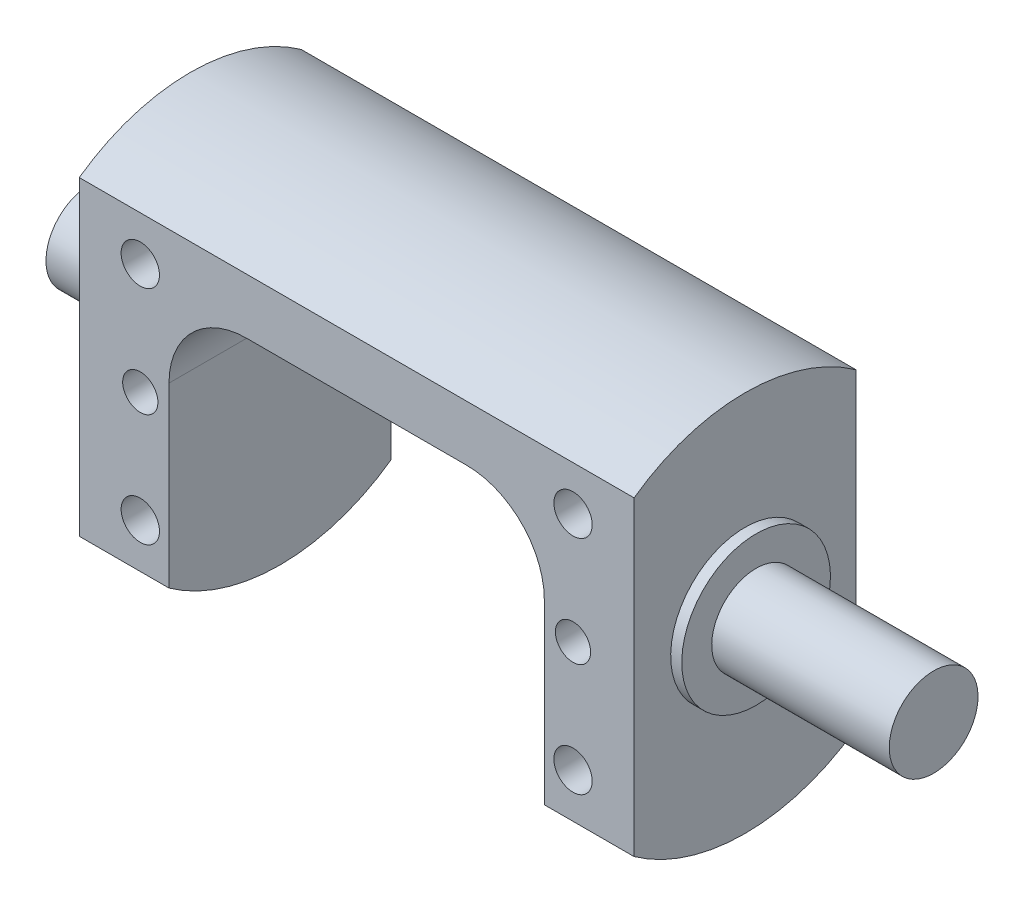
ISO-10303-21;
HEADER;
FILE_DESCRIPTION(('STEP AP214'),'2;1');
FILE_NAME('part.step','',(''),(''),'','','');
FILE_SCHEMA(('AUTOMOTIVE_DESIGN { 1 0 10303 214 1 1 1 1 }'));
ENDSEC;
DATA;
#1=APPLICATION_CONTEXT('core data for automotive mechanical design processes');
#2=APPLICATION_PROTOCOL_DEFINITION('international standard','automotive_design',2000,#1);
#3=PRODUCT_CONTEXT('',#1,'mechanical');
#4=PRODUCT('Part','Part','',(#3));
#5=PRODUCT_RELATED_PRODUCT_CATEGORY('part','',(#4));
#6=PRODUCT_DEFINITION_FORMATION('','',#4);
#7=PRODUCT_DEFINITION_CONTEXT('part definition',#1,'design');
#8=PRODUCT_DEFINITION('design','',#6,#7);
#9=PRODUCT_DEFINITION_SHAPE('','',#8);
#10=(LENGTH_UNIT() NAMED_UNIT(*) SI_UNIT(.MILLI.,.METRE.));
#11=(NAMED_UNIT(*) PLANE_ANGLE_UNIT() SI_UNIT($,.RADIAN.));
#12=(NAMED_UNIT(*) SI_UNIT($,.STERADIAN.) SOLID_ANGLE_UNIT());
#13=UNCERTAINTY_MEASURE_WITH_UNIT(LENGTH_MEASURE(1.E-05),#10,'distance_accuracy_value','');
#14=(GEOMETRIC_REPRESENTATION_CONTEXT(3) GLOBAL_UNCERTAINTY_ASSIGNED_CONTEXT((#13)) GLOBAL_UNIT_ASSIGNED_CONTEXT((#10,
#11,#12)) REPRESENTATION_CONTEXT('',''));
#15=CARTESIAN_POINT('',(0.,0.,0.));
#16=DIRECTION('',(0.,0.,1.));
#17=DIRECTION('',(1.,0.,0.));
#18=AXIS2_PLACEMENT_3D('',#15,#16,#17);
#19=CARTESIAN_POINT('',(-34.,0.,0.));
#20=DIRECTION('',(-1.,0.,0.));
#21=DIRECTION('',(0.,-1.,0.));
#22=AXIS2_PLACEMENT_3D('',#19,#20,#21);
#23=CYLINDRICAL_SURFACE('',#22,17.2046505340852);
#24=DIRECTION('',(-1.,0.,0.));
#25=VECTOR('',#24,1.);
#26=CARTESIAN_POINT('',(-34.,-14.,-9.99999999999999));
#27=LINE('',#26,#25);
#28=CARTESIAN_POINT('',(-16.9125,-14.,-9.99999999999999));
#29=VERTEX_POINT('',#28);
#30=CARTESIAN_POINT('',(-25.,-14.,-9.99999999999999));
#31=VERTEX_POINT('',#30);
#32=EDGE_CURVE('E267',#29,#31,#27,.T.);
#33=ORIENTED_EDGE('',*,*,#32,.F.);
#34=CARTESIAN_POINT('',(-16.9125,0.,0.));
#35=DIRECTION('',(-1.,0.,0.));
#36=DIRECTION('',(0.,0.,1.));
#37=AXIS2_PLACEMENT_3D('',#34,#35,#36);
#38=CIRCLE('',#37,17.2046505340852);
#39=CARTESIAN_POINT('',(-16.9125,-14.,10.));
#40=VERTEX_POINT('',#39);
#41=EDGE_CURVE('E96',#29,#40,#38,.T.);
#42=ORIENTED_EDGE('',*,*,#41,.T.);
#43=DIRECTION('',(-1.,0.,0.));
#44=VECTOR('',#43,1.);
#45=CARTESIAN_POINT('',(-34.,-14.,10.));
#46=LINE('',#45,#44);
#47=CARTESIAN_POINT('',(-25.,-14.,10.));
#48=VERTEX_POINT('',#47);
#49=EDGE_CURVE('E150',#48,#40,#46,.F.);
#50=ORIENTED_EDGE('',*,*,#49,.F.);
#51=CARTESIAN_POINT('',(-25.,0.,0.));
#52=DIRECTION('',(-1.,0.,0.));
#53=DIRECTION('',(0.,-1.,0.));
#54=AXIS2_PLACEMENT_3D('',#51,#52,#53);
#55=CIRCLE('',#54,17.2046505340852);
#56=EDGE_CURVE('E159',#31,#48,#55,.T.);
#57=ORIENTED_EDGE('',*,*,#56,.F.);
#58=EDGE_LOOP('',(#33,#42,#50,#57));
#59=FACE_BOUND('',#58,.T.);
#60=ADVANCED_FACE('F42',(#59),#23,.T.);
#61=CARTESIAN_POINT('',(-34.,4.,0.));
#62=DIRECTION('',(1.,0.,0.));
#63=DIRECTION('',(0.,1.,0.));
#64=AXIS2_PLACEMENT_3D('',#61,#62,#63);
#65=PLANE('',#64);
#66=CARTESIAN_POINT('',(-34.,0.,0.));
#67=DIRECTION('',(-1.,0.,0.));
#68=DIRECTION('',(0.,-1.,0.));
#69=AXIS2_PLACEMENT_3D('',#66,#67,#68);
#70=CIRCLE('',#69,4.);
#71=CARTESIAN_POINT('',(-34.,-4.,0.));
#72=VERTEX_POINT('',#71);
#73=EDGE_CURVE('E273',#72,#72,#70,.T.);
#74=ORIENTED_EDGE('',*,*,#73,.T.);
#75=EDGE_LOOP('',(#74));
#76=FACE_BOUND('',#75,.T.);
#77=CARTESIAN_POINT('',(-34.,0.,0.));
#78=DIRECTION('',(-1.,0.,0.));
#79=DIRECTION('',(0.,0.,1.));
#80=AXIS2_PLACEMENT_3D('',#77,#78,#79);
#81=CIRCLE('',#80,1.7272);
#82=CARTESIAN_POINT('',(-34.,0.,1.7272));
#83=VERTEX_POINT('',#82);
#84=EDGE_CURVE('E209',#83,#83,#81,.T.);
#85=ORIENTED_EDGE('',*,*,#84,.F.);
#86=EDGE_LOOP('',(#85));
#87=FACE_BOUND('',#86,.T.);
#88=ADVANCED_FACE('F44',(#76,#87),#65,.F.);
#89=CARTESIAN_POINT('',(25.,6.69999999999999,0.));
#90=DIRECTION('',(-1.,0.,0.));
#91=DIRECTION('',(0.,-1.,0.));
#92=AXIS2_PLACEMENT_3D('',#89,#90,#91);
#93=PLANE('',#92);
#94=CARTESIAN_POINT('',(25.,0.,0.));
#95=DIRECTION('',(-1.,0.,0.));
#96=DIRECTION('',(0.,-1.,0.));
#97=AXIS2_PLACEMENT_3D('',#94,#95,#96);
#98=CIRCLE('',#97,6.69999999999999);
#99=CARTESIAN_POINT('',(25.,-6.69999999999999,0.));
#100=VERTEX_POINT('',#99);
#101=EDGE_CURVE('E177',#100,#100,#98,.T.);
#102=ORIENTED_EDGE('',*,*,#101,.T.);
#103=EDGE_LOOP('',(#102));
#104=FACE_BOUND('',#103,.T.);
#105=DIRECTION('',(0.,-1.,0.));
#106=VECTOR('',#105,1.);
#107=CARTESIAN_POINT('',(25.,6.69999999999999,-9.99999999999999));
#108=LINE('',#107,#106);
#109=CARTESIAN_POINT('',(25.,14.,-9.99999999999999));
#110=VERTEX_POINT('',#109);
#111=CARTESIAN_POINT('',(25.,-14.,-9.99999999999999));
#112=VERTEX_POINT('',#111);
#113=EDGE_CURVE('E270',#110,#112,#108,.T.);
#114=ORIENTED_EDGE('',*,*,#113,.F.);
#115=CARTESIAN_POINT('',(25.,0.,0.));
#116=DIRECTION('',(-1.,0.,0.));
#117=DIRECTION('',(0.,-1.,0.));
#118=AXIS2_PLACEMENT_3D('',#115,#116,#117);
#119=CIRCLE('',#118,17.2046505340852);
#120=CARTESIAN_POINT('',(25.,14.,10.));
#121=VERTEX_POINT('',#120);
#122=EDGE_CURVE('E168',#121,#110,#119,.T.);
#123=ORIENTED_EDGE('',*,*,#122,.F.);
#124=DIRECTION('',(0.,1.,0.));
#125=VECTOR('',#124,1.);
#126=CARTESIAN_POINT('',(25.,6.7,10.));
#127=LINE('',#126,#125);
#128=CARTESIAN_POINT('',(25.,-14.,10.));
#129=VERTEX_POINT('',#128);
#130=EDGE_CURVE('E146',#129,#121,#127,.T.);
#131=ORIENTED_EDGE('',*,*,#130,.F.);
#132=EDGE_CURVE('E174',#112,#129,#119,.T.);
#133=ORIENTED_EDGE('',*,*,#132,.F.);
#134=EDGE_LOOP('',(#114,#123,#131,#133));
#135=FACE_BOUND('',#134,.T.);
#136=ADVANCED_FACE('F306',(#104,#135),#93,.F.);
#137=ORIENTED_EDGE('',*,*,#122,.T.);
#138=DIRECTION('',(-1.,0.,0.));
#139=VECTOR('',#138,1.);
#140=CARTESIAN_POINT('',(-34.,14.,-9.99999999999999));
#141=LINE('',#140,#139);
#142=CARTESIAN_POINT('',(-25.,14.,-9.99999999999999));
#143=VERTEX_POINT('',#142);
#144=EDGE_CURVE('E165',#143,#110,#141,.F.);
#145=ORIENTED_EDGE('',*,*,#144,.F.);
#146=CARTESIAN_POINT('',(-25.,14.,10.));
#147=VERTEX_POINT('',#146);
#148=EDGE_CURVE('E156',#147,#143,#55,.T.);
#149=ORIENTED_EDGE('',*,*,#148,.F.);
#150=DIRECTION('',(-1.,0.,0.));
#151=VECTOR('',#150,1.);
#152=CARTESIAN_POINT('',(-34.,14.,10.));
#153=LINE('',#152,#151);
#154=EDGE_CURVE('E137',#121,#147,#153,.T.);
#155=ORIENTED_EDGE('',*,*,#154,.F.);
#156=EDGE_LOOP('',(#137,#145,#149,#155));
#157=FACE_BOUND('',#156,.T.);
#158=ADVANCED_FACE('F163',(#157),#23,.T.);
#159=CARTESIAN_POINT('',(16.9125,-14.,10.));
#160=VERTEX_POINT('',#159);
#161=EDGE_CURVE('E263',#160,#129,#46,.F.);
#162=ORIENTED_EDGE('',*,*,#161,.F.);
#163=CARTESIAN_POINT('',(16.9125,0.,0.));
#164=DIRECTION('',(1.,0.,0.));
#165=DIRECTION('',(0.,1.,0.));
#166=AXIS2_PLACEMENT_3D('',#163,#164,#165);
#167=CIRCLE('',#166,17.2046505340852);
#168=CARTESIAN_POINT('',(16.9125,-14.,-9.99999999999999));
#169=VERTEX_POINT('',#168);
#170=EDGE_CURVE('E191',#160,#169,#167,.T.);
#171=ORIENTED_EDGE('',*,*,#170,.T.);
#172=EDGE_CURVE('E268',#112,#169,#27,.T.);
#173=ORIENTED_EDGE('',*,*,#172,.F.);
#174=ORIENTED_EDGE('',*,*,#132,.T.);
#175=EDGE_LOOP('',(#162,#171,#173,#174));
#176=FACE_BOUND('',#175,.T.);
#177=ADVANCED_FACE('F292',(#176),#23,.T.);
#178=CARTESIAN_POINT('',(-25.,17.2046505340852,0.));
#179=DIRECTION('',(1.,0.,0.));
#180=DIRECTION('',(0.,1.,0.));
#181=AXIS2_PLACEMENT_3D('',#178,#179,#180);
#182=PLANE('',#181);
#183=CARTESIAN_POINT('',(-25.,0.,0.));
#184=DIRECTION('',(-1.,0.,0.));
#185=DIRECTION('',(0.,-1.,0.));
#186=AXIS2_PLACEMENT_3D('',#183,#184,#185);
#187=CIRCLE('',#186,6.69999999999999);
#188=CARTESIAN_POINT('',(-25.,-6.69999999999999,0.));
#189=VERTEX_POINT('',#188);
#190=EDGE_CURVE('E166',#189,#189,#187,.T.);
#191=ORIENTED_EDGE('',*,*,#190,.F.);
#192=EDGE_LOOP('',(#191));
#193=FACE_BOUND('',#192,.T.);
#194=DIRECTION('',(0.,1.,0.));
#195=VECTOR('',#194,1.);
#196=CARTESIAN_POINT('',(-25.,17.2046505340852,-9.99999999999999));
#197=LINE('',#196,#195);
#198=EDGE_CURVE('E52',#31,#143,#197,.T.);
#199=ORIENTED_EDGE('',*,*,#198,.F.);
#200=ORIENTED_EDGE('',*,*,#56,.T.);
#201=DIRECTION('',(0.,-1.,0.));
#202=VECTOR('',#201,1.);
#203=CARTESIAN_POINT('',(-25.,17.2046505340852,10.));
#204=LINE('',#203,#202);
#205=EDGE_CURVE('E143',#147,#48,#204,.T.);
#206=ORIENTED_EDGE('',*,*,#205,.F.);
#207=ORIENTED_EDGE('',*,*,#148,.T.);
#208=EDGE_LOOP('',(#199,#200,#206,#207));
#209=FACE_BOUND('',#208,.T.);
#210=ADVANCED_FACE('F155',(#193,#209),#182,.F.);
#211=CARTESIAN_POINT('',(42.,0.,0.));
#212=DIRECTION('',(-1.,0.,0.));
#213=DIRECTION('',(0.,-1.,0.));
#214=AXIS2_PLACEMENT_3D('',#211,#212,#213);
#215=PLANE('',#214);
#216=CARTESIAN_POINT('',(42.,0.,0.));
#217=DIRECTION('',(-1.,0.,0.));
#218=DIRECTION('',(0.,-1.,0.));
#219=AXIS2_PLACEMENT_3D('',#216,#217,#218);
#220=CIRCLE('',#219,4.00000000000001);
#221=CARTESIAN_POINT('',(42.,-4.00000000000001,0.));
#222=VERTEX_POINT('',#221);
#223=EDGE_CURVE('E160',#222,#222,#220,.T.);
#224=ORIENTED_EDGE('',*,*,#223,.F.);
#225=EDGE_LOOP('',(#224));
#226=FACE_BOUND('',#225,.T.);
#227=ADVANCED_FACE('F291',(#226),#215,.F.);
#228=CARTESIAN_POINT('',(-34.,0.,0.));
#229=DIRECTION('',(-1.,0.,0.));
#230=DIRECTION('',(0.,-1.,0.));
#231=AXIS2_PLACEMENT_3D('',#228,#229,#230);
#232=CYLINDRICAL_SURFACE('',#231,4.00000000000001);
#233=CARTESIAN_POINT('',(26.,0.,0.));
#234=DIRECTION('',(-1.,0.,0.));
#235=DIRECTION('',(0.,-1.,0.));
#236=AXIS2_PLACEMENT_3D('',#233,#234,#235);
#237=CIRCLE('',#236,4.00000000000001);
#238=CARTESIAN_POINT('',(26.,-4.00000000000001,0.));
#239=VERTEX_POINT('',#238);
#240=EDGE_CURVE('E183',#239,#239,#237,.T.);
#241=ORIENTED_EDGE('',*,*,#240,.F.);
#242=EDGE_LOOP('',(#241));
#243=FACE_BOUND('',#242,.T.);
#244=ORIENTED_EDGE('',*,*,#223,.T.);
#245=EDGE_LOOP('',(#244));
#246=FACE_BOUND('',#245,.T.);
#247=ADVANCED_FACE('F298',(#243,#246),#232,.T.);
#248=CARTESIAN_POINT('',(26.,4.00000000000001,0.));
#249=DIRECTION('',(-1.,0.,0.));
#250=DIRECTION('',(0.,-1.,0.));
#251=AXIS2_PLACEMENT_3D('',#248,#249,#250);
#252=PLANE('',#251);
#253=CARTESIAN_POINT('',(26.,0.,0.));
#254=DIRECTION('',(-1.,0.,0.));
#255=DIRECTION('',(0.,-1.,0.));
#256=AXIS2_PLACEMENT_3D('',#253,#254,#255);
#257=CIRCLE('',#256,6.7);
#258=CARTESIAN_POINT('',(26.,-6.7,0.));
#259=VERTEX_POINT('',#258);
#260=EDGE_CURVE('E180',#259,#259,#257,.T.);
#261=ORIENTED_EDGE('',*,*,#260,.F.);
#262=EDGE_LOOP('',(#261));
#263=FACE_BOUND('',#262,.T.);
#264=ORIENTED_EDGE('',*,*,#240,.T.);
#265=EDGE_LOOP('',(#264));
#266=FACE_BOUND('',#265,.T.);
#267=ADVANCED_FACE('F321',(#263,#266),#252,.F.);
#268=CARTESIAN_POINT('',(-34.,0.,0.));
#269=DIRECTION('',(-1.,0.,0.));
#270=DIRECTION('',(0.,-1.,0.));
#271=AXIS2_PLACEMENT_3D('',#268,#269,#270);
#272=CYLINDRICAL_SURFACE('',#271,6.7);
#273=ORIENTED_EDGE('',*,*,#101,.F.);
#274=EDGE_LOOP('',(#273));
#275=FACE_BOUND('',#274,.T.);
#276=ORIENTED_EDGE('',*,*,#260,.T.);
#277=EDGE_LOOP('',(#276));
#278=FACE_BOUND('',#277,.T.);
#279=ADVANCED_FACE('F286',(#275,#278),#272,.T.);
#280=CARTESIAN_POINT('',(-34.,0.,0.));
#281=DIRECTION('',(-1.,0.,0.));
#282=DIRECTION('',(0.,-1.,0.));
#283=AXIS2_PLACEMENT_3D('',#280,#281,#282);
#284=CYLINDRICAL_SURFACE('',#283,6.69999999999999);
#285=CARTESIAN_POINT('',(-27.5,0.,0.));
#286=DIRECTION('',(-1.,0.,0.));
#287=DIRECTION('',(0.,-1.,0.));
#288=AXIS2_PLACEMENT_3D('',#285,#286,#287);
#289=CIRCLE('',#288,6.69999999999999);
#290=CARTESIAN_POINT('',(-27.5,-6.69999999999999,0.));
#291=VERTEX_POINT('',#290);
#292=EDGE_CURVE('E170',#291,#291,#289,.T.);
#293=ORIENTED_EDGE('',*,*,#292,.F.);
#294=EDGE_LOOP('',(#293));
#295=FACE_BOUND('',#294,.T.);
#296=ORIENTED_EDGE('',*,*,#190,.T.);
#297=EDGE_LOOP('',(#296));
#298=FACE_BOUND('',#297,.T.);
#299=ADVANCED_FACE('F283',(#295,#298),#284,.T.);
#300=CARTESIAN_POINT('',(-27.5,6.69999999999999,0.));
#301=DIRECTION('',(1.,0.,0.));
#302=DIRECTION('',(0.,1.,0.));
#303=AXIS2_PLACEMENT_3D('',#300,#301,#302);
#304=PLANE('',#303);
#305=CARTESIAN_POINT('',(-27.5,0.,0.));
#306=DIRECTION('',(-1.,0.,0.));
#307=DIRECTION('',(0.,-1.,0.));
#308=AXIS2_PLACEMENT_3D('',#305,#306,#307);
#309=CIRCLE('',#308,4.);
#310=CARTESIAN_POINT('',(-27.5,-4.,0.));
#311=VERTEX_POINT('',#310);
#312=EDGE_CURVE('E276',#311,#311,#309,.T.);
#313=ORIENTED_EDGE('',*,*,#312,.F.);
#314=EDGE_LOOP('',(#313));
#315=FACE_BOUND('',#314,.T.);
#316=ORIENTED_EDGE('',*,*,#292,.T.);
#317=EDGE_LOOP('',(#316));
#318=FACE_BOUND('',#317,.T.);
#319=ADVANCED_FACE('F281',(#315,#318),#304,.F.);
#320=CARTESIAN_POINT('',(-34.,0.,0.));
#321=DIRECTION('',(-1.,0.,0.));
#322=DIRECTION('',(0.,-1.,0.));
#323=AXIS2_PLACEMENT_3D('',#320,#321,#322);
#324=CYLINDRICAL_SURFACE('',#323,4.);
#325=ORIENTED_EDGE('',*,*,#73,.F.);
#326=EDGE_LOOP('',(#325));
#327=FACE_BOUND('',#326,.T.);
#328=ORIENTED_EDGE('',*,*,#312,.T.);
#329=EDGE_LOOP('',(#328));
#330=FACE_BOUND('',#329,.T.);
#331=ADVANCED_FACE('F354',(#327,#330),#324,.T.);
#332=CARTESIAN_POINT('',(42.,17.2046505340852,10.));
#333=DIRECTION('',(0.,0.,1.));
#334=DIRECTION('',(0.,-1.,0.));
#335=AXIS2_PLACEMENT_3D('',#332,#333,#334);
#336=PLANE('',#335);
#337=DIRECTION('',(0.,-1.,0.));
#338=VECTOR('',#337,1.);
#339=CARTESIAN_POINT('',(-16.9125,17.2046505340852,10.));
#340=LINE('',#339,#338);
#341=CARTESIAN_POINT('',(-16.9125,1.99999999999999,10.));
#342=VERTEX_POINT('',#341);
#343=EDGE_CURVE('E193',#342,#40,#340,.T.);
#344=ORIENTED_EDGE('',*,*,#343,.F.);
#345=CARTESIAN_POINT('',(-9.9125,1.99999999999999,10.));
#346=DIRECTION('',(0.,0.,1.));
#347=DIRECTION('',(1.,0.,0.));
#348=AXIS2_PLACEMENT_3D('',#345,#346,#347);
#349=CIRCLE('',#348,7.);
#350=CARTESIAN_POINT('',(-9.9125,8.99999999999999,10.));
#351=VERTEX_POINT('',#350);
#352=EDGE_CURVE('E46',#351,#342,#349,.T.);
#353=ORIENTED_EDGE('',*,*,#352,.F.);
#354=DIRECTION('',(1.,0.,0.));
#355=VECTOR('',#354,1.);
#356=CARTESIAN_POINT('',(-9.9125,8.99999999999999,10.));
#357=LINE('',#356,#355);
#358=CARTESIAN_POINT('',(9.9125,8.99999999999999,10.));
#359=VERTEX_POINT('',#358);
#360=EDGE_CURVE('E81',#359,#351,#357,.F.);
#361=ORIENTED_EDGE('',*,*,#360,.F.);
#362=CARTESIAN_POINT('',(9.9125,1.99999999999999,10.));
#363=DIRECTION('',(0.,0.,1.));
#364=DIRECTION('',(1.,0.,0.));
#365=AXIS2_PLACEMENT_3D('',#362,#363,#364);
#366=CIRCLE('',#365,7.);
#367=CARTESIAN_POINT('',(16.9125,1.99999999999999,10.));
#368=VERTEX_POINT('',#367);
#369=EDGE_CURVE('E195',#368,#359,#366,.T.);
#370=ORIENTED_EDGE('',*,*,#369,.F.);
#371=DIRECTION('',(0.,1.,0.));
#372=VECTOR('',#371,1.);
#373=CARTESIAN_POINT('',(16.9125,17.2046505340853,10.));
#374=LINE('',#373,#372);
#375=EDGE_CURVE('E189',#160,#368,#374,.T.);
#376=ORIENTED_EDGE('',*,*,#375,.F.);
#377=ORIENTED_EDGE('',*,*,#161,.T.);
#378=ORIENTED_EDGE('',*,*,#130,.T.);
#379=ORIENTED_EDGE('',*,*,#154,.T.);
#380=ORIENTED_EDGE('',*,*,#205,.T.);
#381=ORIENTED_EDGE('',*,*,#49,.T.);
#382=EDGE_LOOP('',(#344,#353,#361,#370,#376,#377,#378,#379,#380,#381));
#383=FACE_BOUND('',#382,.T.);
#384=CARTESIAN_POINT('',(19.5,0.,9.99999999999999));
#385=DIRECTION('',(0.,0.,1.));
#386=DIRECTION('',(0.,-1.,0.));
#387=AXIS2_PLACEMENT_3D('',#384,#385,#386);
#388=CIRCLE('',#387,1.5875);
#389=CARTESIAN_POINT('',(19.5,-1.5875,9.99999999999999));
#390=VERTEX_POINT('',#389);
#391=EDGE_CURVE('E215',#390,#390,#388,.T.);
#392=ORIENTED_EDGE('',*,*,#391,.F.);
#393=EDGE_LOOP('',(#392));
#394=FACE_BOUND('',#393,.T.);
#395=CARTESIAN_POINT('',(-19.5,0.,9.99999999999999));
#396=DIRECTION('',(0.,0.,1.));
#397=DIRECTION('',(0.,-1.,0.));
#398=AXIS2_PLACEMENT_3D('',#395,#396,#397);
#399=CIRCLE('',#398,1.5875);
#400=CARTESIAN_POINT('',(-19.5,-1.5875,9.99999999999999));
#401=VERTEX_POINT('',#400);
#402=EDGE_CURVE('E221',#401,#401,#399,.T.);
#403=ORIENTED_EDGE('',*,*,#402,.F.);
#404=EDGE_LOOP('',(#403));
#405=FACE_BOUND('',#404,.T.);
#406=CARTESIAN_POINT('',(19.5,10.,10.));
#407=DIRECTION('',(0.,0.,1.));
#408=DIRECTION('',(0.,-1.,0.));
#409=AXIS2_PLACEMENT_3D('',#406,#407,#408);
#410=CIRCLE('',#409,1.72719999999999);
#411=CARTESIAN_POINT('',(19.5,8.27280000000001,10.));
#412=VERTEX_POINT('',#411);
#413=EDGE_CURVE('E227',#412,#412,#410,.T.);
#414=ORIENTED_EDGE('',*,*,#413,.F.);
#415=EDGE_LOOP('',(#414));
#416=FACE_BOUND('',#415,.T.);
#417=CARTESIAN_POINT('',(-19.5,-10.,9.99999999999999));
#418=DIRECTION('',(0.,0.,1.));
#419=DIRECTION('',(0.,-1.,0.));
#420=AXIS2_PLACEMENT_3D('',#417,#418,#419);
#421=CIRCLE('',#420,1.72719999999999);
#422=CARTESIAN_POINT('',(-19.5,-11.7272,9.99999999999999));
#423=VERTEX_POINT('',#422);
#424=EDGE_CURVE('E230',#423,#423,#421,.T.);
#425=ORIENTED_EDGE('',*,*,#424,.F.);
#426=EDGE_LOOP('',(#425));
#427=FACE_BOUND('',#426,.T.);
#428=CARTESIAN_POINT('',(19.5,-10.,9.99999999999999));
#429=DIRECTION('',(0.,0.,1.));
#430=DIRECTION('',(0.,-1.,0.));
#431=AXIS2_PLACEMENT_3D('',#428,#429,#430);
#432=CIRCLE('',#431,1.72719999999999);
#433=CARTESIAN_POINT('',(19.5,-11.7272,9.99999999999999));
#434=VERTEX_POINT('',#433);
#435=EDGE_CURVE('E233',#434,#434,#432,.T.);
#436=ORIENTED_EDGE('',*,*,#435,.F.);
#437=EDGE_LOOP('',(#436));
#438=FACE_BOUND('',#437,.T.);
#439=CARTESIAN_POINT('',(-19.5,10.,10.));
#440=DIRECTION('',(0.,0.,1.));
#441=DIRECTION('',(0.,-1.,0.));
#442=AXIS2_PLACEMENT_3D('',#439,#440,#441);
#443=CIRCLE('',#442,1.72719999999999);
#444=CARTESIAN_POINT('',(-19.5,8.27280000000001,10.));
#445=VERTEX_POINT('',#444);
#446=EDGE_CURVE('E236',#445,#445,#443,.T.);
#447=ORIENTED_EDGE('',*,*,#446,.F.);
#448=EDGE_LOOP('',(#447));
#449=FACE_BOUND('',#448,.T.);
#450=ADVANCED_FACE('F140',(#383,#394,#405,#416,#427,#438,#449),#336,.T.);
#451=CARTESIAN_POINT('',(42.,17.2046505340852,-9.99999999999999));
#452=DIRECTION('',(0.,0.,-1.));
#453=DIRECTION('',(0.,1.,0.));
#454=AXIS2_PLACEMENT_3D('',#451,#452,#453);
#455=PLANE('',#454);
#456=DIRECTION('',(0.,-1.,0.));
#457=VECTOR('',#456,1.);
#458=CARTESIAN_POINT('',(-16.9125,-30.3916467847906,-9.99999999999999));
#459=LINE('',#458,#457);
#460=CARTESIAN_POINT('',(-16.9125,1.99999999999999,-9.99999999999999));
#461=VERTEX_POINT('',#460);
#462=EDGE_CURVE('E712',#461,#29,#459,.T.);
#463=ORIENTED_EDGE('',*,*,#462,.T.);
#464=ORIENTED_EDGE('',*,*,#32,.T.);
#465=ORIENTED_EDGE('',*,*,#198,.T.);
#466=ORIENTED_EDGE('',*,*,#144,.T.);
#467=ORIENTED_EDGE('',*,*,#113,.T.);
#468=ORIENTED_EDGE('',*,*,#172,.T.);
#469=DIRECTION('',(0.,-1.,0.));
#470=VECTOR('',#469,1.);
#471=CARTESIAN_POINT('',(16.9125,17.2046505340852,-9.99999999999999));
#472=LINE('',#471,#470);
#473=CARTESIAN_POINT('',(16.9125,1.99999999999999,-9.99999999999999));
#474=VERTEX_POINT('',#473);
#475=EDGE_CURVE('E12',#474,#169,#472,.T.);
#476=ORIENTED_EDGE('',*,*,#475,.F.);
#477=CARTESIAN_POINT('',(9.9125,1.99999999999999,-9.99999999999999));
#478=DIRECTION('',(0.,0.,1.));
#479=DIRECTION('',(-1.,0.,0.));
#480=AXIS2_PLACEMENT_3D('',#477,#478,#479);
#481=CIRCLE('',#480,7.);
#482=CARTESIAN_POINT('',(9.9125,8.99999999999999,-9.99999999999999));
#483=VERTEX_POINT('',#482);
#484=EDGE_CURVE('E61',#474,#483,#481,.T.);
#485=ORIENTED_EDGE('',*,*,#484,.T.);
#486=DIRECTION('',(-1.,0.,0.));
#487=VECTOR('',#486,1.);
#488=CARTESIAN_POINT('',(-9.9125,8.99999999999999,-9.99999999999999));
#489=LINE('',#488,#487);
#490=CARTESIAN_POINT('',(-9.9125,8.99999999999999,-9.99999999999999));
#491=VERTEX_POINT('',#490);
#492=EDGE_CURVE('E720',#483,#491,#489,.T.);
#493=ORIENTED_EDGE('',*,*,#492,.T.);
#494=CARTESIAN_POINT('',(-9.9125,1.99999999999999,-9.99999999999999));
#495=DIRECTION('',(0.,0.,1.));
#496=DIRECTION('',(-1.,0.,0.));
#497=AXIS2_PLACEMENT_3D('',#494,#495,#496);
#498=CIRCLE('',#497,7.);
#499=EDGE_CURVE('E718',#491,#461,#498,.T.);
#500=ORIENTED_EDGE('',*,*,#499,.T.);
#501=EDGE_LOOP('',(#463,#464,#465,#466,#467,#468,#476,#485,#493,#500));
#502=FACE_BOUND('',#501,.T.);
#503=CARTESIAN_POINT('',(19.5,0.,-9.99999999999999));
#504=DIRECTION('',(0.,0.,-1.));
#505=DIRECTION('',(0.,1.,0.));
#506=AXIS2_PLACEMENT_3D('',#503,#504,#505);
#507=CIRCLE('',#506,1.5875);
#508=CARTESIAN_POINT('',(19.5,1.5875,-9.99999999999999));
#509=VERTEX_POINT('',#508);
#510=EDGE_CURVE('E239',#509,#509,#507,.T.);
#511=ORIENTED_EDGE('',*,*,#510,.F.);
#512=EDGE_LOOP('',(#511));
#513=FACE_BOUND('',#512,.T.);
#514=CARTESIAN_POINT('',(-19.5,0.,-9.99999999999999));
#515=DIRECTION('',(0.,0.,-1.));
#516=DIRECTION('',(0.,1.,0.));
#517=AXIS2_PLACEMENT_3D('',#514,#515,#516);
#518=CIRCLE('',#517,1.5875);
#519=CARTESIAN_POINT('',(-19.5,1.5875,-9.99999999999999));
#520=VERTEX_POINT('',#519);
#521=EDGE_CURVE('E245',#520,#520,#518,.T.);
#522=ORIENTED_EDGE('',*,*,#521,.F.);
#523=EDGE_LOOP('',(#522));
#524=FACE_BOUND('',#523,.T.);
#525=CARTESIAN_POINT('',(19.5,10.,-10.));
#526=DIRECTION('',(0.,0.,-1.));
#527=DIRECTION('',(0.,1.,0.));
#528=AXIS2_PLACEMENT_3D('',#525,#526,#527);
#529=CIRCLE('',#528,1.72719999999999);
#530=CARTESIAN_POINT('',(19.5,11.7272,-10.));
#531=VERTEX_POINT('',#530);
#532=EDGE_CURVE('E251',#531,#531,#529,.T.);
#533=ORIENTED_EDGE('',*,*,#532,.F.);
#534=EDGE_LOOP('',(#533));
#535=FACE_BOUND('',#534,.T.);
#536=CARTESIAN_POINT('',(-19.5,-10.,-9.99999999999999));
#537=DIRECTION('',(0.,0.,-1.));
#538=DIRECTION('',(0.,1.,0.));
#539=AXIS2_PLACEMENT_3D('',#536,#537,#538);
#540=CIRCLE('',#539,1.72719999999999);
#541=CARTESIAN_POINT('',(-19.5,-8.27280000000001,-9.99999999999999));
#542=VERTEX_POINT('',#541);
#543=EDGE_CURVE('E254',#542,#542,#540,.T.);
#544=ORIENTED_EDGE('',*,*,#543,.F.);
#545=EDGE_LOOP('',(#544));
#546=FACE_BOUND('',#545,.T.);
#547=CARTESIAN_POINT('',(19.5,-10.,-9.99999999999999));
#548=DIRECTION('',(0.,0.,-1.));
#549=DIRECTION('',(0.,1.,0.));
#550=AXIS2_PLACEMENT_3D('',#547,#548,#549);
#551=CIRCLE('',#550,1.72719999999999);
#552=CARTESIAN_POINT('',(19.5,-8.27280000000001,-9.99999999999999));
#553=VERTEX_POINT('',#552);
#554=EDGE_CURVE('E257',#553,#553,#551,.T.);
#555=ORIENTED_EDGE('',*,*,#554,.F.);
#556=EDGE_LOOP('',(#555));
#557=FACE_BOUND('',#556,.T.);
#558=CARTESIAN_POINT('',(-19.5,10.,-10.));
#559=DIRECTION('',(0.,0.,-1.));
#560=DIRECTION('',(0.,1.,0.));
#561=AXIS2_PLACEMENT_3D('',#558,#559,#560);
#562=CIRCLE('',#561,1.72719999999999);
#563=CARTESIAN_POINT('',(-19.5,11.7272,-10.));
#564=VERTEX_POINT('',#563);
#565=EDGE_CURVE('E260',#564,#564,#562,.T.);
#566=ORIENTED_EDGE('',*,*,#565,.F.);
#567=EDGE_LOOP('',(#566));
#568=FACE_BOUND('',#567,.T.);
#569=ADVANCED_FACE('F369',(#502,#513,#524,#535,#546,#557,#568),#455,.T.);
#570=CARTESIAN_POINT('',(-19.5,10.,-9.99999999999999));
#571=DIRECTION('',(0.,0.,-1.));
#572=DIRECTION('',(0.,1.,0.));
#573=AXIS2_PLACEMENT_3D('',#570,#571,#572);
#574=CYLINDRICAL_SURFACE('',#573,1.72719999999999);
#575=ORIENTED_EDGE('',*,*,#565,.T.);
#576=EDGE_LOOP('',(#575));
#577=FACE_BOUND('',#576,.T.);
#578=ORIENTED_EDGE('',*,*,#446,.T.);
#579=EDGE_LOOP('',(#578));
#580=FACE_BOUND('',#579,.T.);
#581=ADVANCED_FACE('F377',(#577,#580),#574,.F.);
#582=CARTESIAN_POINT('',(19.5,-10.,-9.99999999999999));
#583=DIRECTION('',(0.,0.,-1.));
#584=DIRECTION('',(0.,1.,0.));
#585=AXIS2_PLACEMENT_3D('',#582,#583,#584);
#586=CYLINDRICAL_SURFACE('',#585,1.72719999999999);
#587=ORIENTED_EDGE('',*,*,#554,.T.);
#588=EDGE_LOOP('',(#587));
#589=FACE_BOUND('',#588,.T.);
#590=ORIENTED_EDGE('',*,*,#435,.T.);
#591=EDGE_LOOP('',(#590));
#592=FACE_BOUND('',#591,.T.);
#593=ADVANCED_FACE('F386',(#589,#592),#586,.F.);
#594=CARTESIAN_POINT('',(-19.5,-10.,-9.99999999999999));
#595=DIRECTION('',(0.,0.,-1.));
#596=DIRECTION('',(0.,1.,0.));
#597=AXIS2_PLACEMENT_3D('',#594,#595,#596);
#598=CYLINDRICAL_SURFACE('',#597,1.72719999999999);
#599=ORIENTED_EDGE('',*,*,#543,.T.);
#600=EDGE_LOOP('',(#599));
#601=FACE_BOUND('',#600,.T.);
#602=ORIENTED_EDGE('',*,*,#424,.T.);
#603=EDGE_LOOP('',(#602));
#604=FACE_BOUND('',#603,.T.);
#605=ADVANCED_FACE('F395',(#601,#604),#598,.F.);
#606=CARTESIAN_POINT('',(19.5,10.,-9.99999999999999));
#607=DIRECTION('',(0.,0.,-1.));
#608=DIRECTION('',(0.,1.,0.));
#609=AXIS2_PLACEMENT_3D('',#606,#607,#608);
#610=CYLINDRICAL_SURFACE('',#609,1.72719999999999);
#611=ORIENTED_EDGE('',*,*,#532,.T.);
#612=EDGE_LOOP('',(#611));
#613=FACE_BOUND('',#612,.T.);
#614=ORIENTED_EDGE('',*,*,#413,.T.);
#615=EDGE_LOOP('',(#614));
#616=FACE_BOUND('',#615,.T.);
#617=ADVANCED_FACE('F404',(#613,#616),#610,.F.);
#618=CARTESIAN_POINT('',(-19.5,0.,-3.99999999999999));
#619=DIRECTION('',(0.,0.,-1.));
#620=DIRECTION('',(0.,1.,0.));
#621=AXIS2_PLACEMENT_3D('',#618,#619,#620);
#622=CONICAL_SURFACE('',#621,1.5875,1.02974425867665);
#623=CARTESIAN_POINT('',(-19.5,0.,-3.04613376729374));
#624=VERTEX_POINT('',#623);
#625=VERTEX_LOOP('',#624);
#626=FACE_BOUND('',#625,.T.);
#627=CARTESIAN_POINT('',(-19.5,0.,-3.99999999999999));
#628=DIRECTION('',(0.,0.,-1.));
#629=DIRECTION('',(0.,1.,0.));
#630=AXIS2_PLACEMENT_3D('',#627,#628,#629);
#631=CIRCLE('',#630,1.5875);
#632=CARTESIAN_POINT('',(-19.5,1.5875,-3.99999999999999));
#633=VERTEX_POINT('',#632);
#634=EDGE_CURVE('E248',#633,#633,#631,.T.);
#635=ORIENTED_EDGE('',*,*,#634,.T.);
#636=EDGE_LOOP('',(#635));
#637=FACE_BOUND('',#636,.T.);
#638=ADVANCED_FACE('F411',(#626,#637),#622,.F.);
#639=CARTESIAN_POINT('',(-19.5,0.,-9.99999999999999));
#640=DIRECTION('',(0.,0.,-1.));
#641=DIRECTION('',(0.,1.,0.));
#642=AXIS2_PLACEMENT_3D('',#639,#640,#641);
#643=CYLINDRICAL_SURFACE('',#642,1.5875);
#644=ORIENTED_EDGE('',*,*,#634,.F.);
#645=EDGE_LOOP('',(#644));
#646=FACE_BOUND('',#645,.T.);
#647=ORIENTED_EDGE('',*,*,#521,.T.);
#648=EDGE_LOOP('',(#647));
#649=FACE_BOUND('',#648,.T.);
#650=ADVANCED_FACE('F419',(#646,#649),#643,.F.);
#651=CARTESIAN_POINT('',(19.5,0.,-3.99999999999999));
#652=DIRECTION('',(0.,0.,-1.));
#653=DIRECTION('',(0.,1.,0.));
#654=AXIS2_PLACEMENT_3D('',#651,#652,#653);
#655=CONICAL_SURFACE('',#654,1.5875,1.02974425867665);
#656=CARTESIAN_POINT('',(19.5,0.,-3.04613376729374));
#657=VERTEX_POINT('',#656);
#658=VERTEX_LOOP('',#657);
#659=FACE_BOUND('',#658,.T.);
#660=CARTESIAN_POINT('',(19.5,0.,-3.99999999999999));
#661=DIRECTION('',(0.,0.,-1.));
#662=DIRECTION('',(0.,1.,0.));
#663=AXIS2_PLACEMENT_3D('',#660,#661,#662);
#664=CIRCLE('',#663,1.5875);
#665=CARTESIAN_POINT('',(19.5,1.5875,-3.99999999999999));
#666=VERTEX_POINT('',#665);
#667=EDGE_CURVE('E242',#666,#666,#664,.T.);
#668=ORIENTED_EDGE('',*,*,#667,.T.);
#669=EDGE_LOOP('',(#668));
#670=FACE_BOUND('',#669,.T.);
#671=ADVANCED_FACE('F427',(#659,#670),#655,.F.);
#672=CARTESIAN_POINT('',(19.5,0.,-9.99999999999999));
#673=DIRECTION('',(0.,0.,-1.));
#674=DIRECTION('',(0.,1.,0.));
#675=AXIS2_PLACEMENT_3D('',#672,#673,#674);
#676=CYLINDRICAL_SURFACE('',#675,1.5875);
#677=ORIENTED_EDGE('',*,*,#667,.F.);
#678=EDGE_LOOP('',(#677));
#679=FACE_BOUND('',#678,.T.);
#680=ORIENTED_EDGE('',*,*,#510,.T.);
#681=EDGE_LOOP('',(#680));
#682=FACE_BOUND('',#681,.T.);
#683=ADVANCED_FACE('F435',(#679,#682),#676,.F.);
#684=CARTESIAN_POINT('',(-19.5,0.,3.99999999999999));
#685=DIRECTION('',(0.,0.,1.));
#686=DIRECTION('',(0.,-1.,0.));
#687=AXIS2_PLACEMENT_3D('',#684,#685,#686);
#688=CONICAL_SURFACE('',#687,1.5875,1.02974425867665);
#689=CARTESIAN_POINT('',(-19.5,0.,3.04613376729374));
#690=VERTEX_POINT('',#689);
#691=VERTEX_LOOP('',#690);
#692=FACE_BOUND('',#691,.T.);
#693=CARTESIAN_POINT('',(-19.5,0.,3.99999999999999));
#694=DIRECTION('',(0.,0.,1.));
#695=DIRECTION('',(0.,-1.,0.));
#696=AXIS2_PLACEMENT_3D('',#693,#694,#695);
#697=CIRCLE('',#696,1.5875);
#698=CARTESIAN_POINT('',(-19.5,-1.5875,3.99999999999999));
#699=VERTEX_POINT('',#698);
#700=EDGE_CURVE('E224',#699,#699,#697,.T.);
#701=ORIENTED_EDGE('',*,*,#700,.T.);
#702=EDGE_LOOP('',(#701));
#703=FACE_BOUND('',#702,.T.);
#704=ADVANCED_FACE('F443',(#692,#703),#688,.F.);
#705=CARTESIAN_POINT('',(-19.5,0.,9.99999999999999));
#706=DIRECTION('',(0.,0.,1.));
#707=DIRECTION('',(0.,-1.,0.));
#708=AXIS2_PLACEMENT_3D('',#705,#706,#707);
#709=CYLINDRICAL_SURFACE('',#708,1.5875);
#710=ORIENTED_EDGE('',*,*,#700,.F.);
#711=EDGE_LOOP('',(#710));
#712=FACE_BOUND('',#711,.T.);
#713=ORIENTED_EDGE('',*,*,#402,.T.);
#714=EDGE_LOOP('',(#713));
#715=FACE_BOUND('',#714,.T.);
#716=ADVANCED_FACE('F452',(#712,#715),#709,.F.);
#717=CARTESIAN_POINT('',(19.5,0.,3.99999999999999));
#718=DIRECTION('',(0.,0.,1.));
#719=DIRECTION('',(0.,-1.,0.));
#720=AXIS2_PLACEMENT_3D('',#717,#718,#719);
#721=CONICAL_SURFACE('',#720,1.5875,1.02974425867665);
#722=CARTESIAN_POINT('',(19.5,0.,3.04613376729374));
#723=VERTEX_POINT('',#722);
#724=VERTEX_LOOP('',#723);
#725=FACE_BOUND('',#724,.T.);
#726=CARTESIAN_POINT('',(19.5,0.,3.99999999999999));
#727=DIRECTION('',(0.,0.,1.));
#728=DIRECTION('',(0.,-1.,0.));
#729=AXIS2_PLACEMENT_3D('',#726,#727,#728);
#730=CIRCLE('',#729,1.5875);
#731=CARTESIAN_POINT('',(19.5,-1.5875,3.99999999999999));
#732=VERTEX_POINT('',#731);
#733=EDGE_CURVE('E218',#732,#732,#730,.T.);
#734=ORIENTED_EDGE('',*,*,#733,.T.);
#735=EDGE_LOOP('',(#734));
#736=FACE_BOUND('',#735,.T.);
#737=ADVANCED_FACE('F461',(#725,#736),#721,.F.);
#738=CARTESIAN_POINT('',(19.5,0.,9.99999999999999));
#739=DIRECTION('',(0.,0.,1.));
#740=DIRECTION('',(0.,-1.,0.));
#741=AXIS2_PLACEMENT_3D('',#738,#739,#740);
#742=CYLINDRICAL_SURFACE('',#741,1.5875);
#743=ORIENTED_EDGE('',*,*,#733,.F.);
#744=EDGE_LOOP('',(#743));
#745=FACE_BOUND('',#744,.T.);
#746=ORIENTED_EDGE('',*,*,#391,.T.);
#747=EDGE_LOOP('',(#746));
#748=FACE_BOUND('',#747,.T.);
#749=ADVANCED_FACE('F469',(#745,#748),#742,.F.);
#750=CARTESIAN_POINT('',(-23.29,0.,0.));
#751=DIRECTION('',(-1.,0.,0.));
#752=DIRECTION('',(0.,0.,1.));
#753=AXIS2_PLACEMENT_3D('',#750,#751,#752);
#754=CONICAL_SURFACE('',#753,1.7272,1.02974425867665);
#755=CARTESIAN_POINT('',(-22.2521935388156,0.,0.));
#756=VERTEX_POINT('',#755);
#757=VERTEX_LOOP('',#756);
#758=FACE_BOUND('',#757,.T.);
#759=CARTESIAN_POINT('',(-23.29,0.,0.));
#760=DIRECTION('',(-1.,0.,0.));
#761=DIRECTION('',(0.,0.,1.));
#762=AXIS2_PLACEMENT_3D('',#759,#760,#761);
#763=CIRCLE('',#762,1.7272);
#764=CARTESIAN_POINT('',(-23.29,0.,1.7272));
#765=VERTEX_POINT('',#764);
#766=EDGE_CURVE('E212',#765,#765,#763,.T.);
#767=ORIENTED_EDGE('',*,*,#766,.T.);
#768=EDGE_LOOP('',(#767));
#769=FACE_BOUND('',#768,.T.);
#770=ADVANCED_FACE('F477',(#758,#769),#754,.F.);
#771=CARTESIAN_POINT('',(-34.,0.,0.));
#772=DIRECTION('',(-1.,0.,0.));
#773=DIRECTION('',(0.,0.,1.));
#774=AXIS2_PLACEMENT_3D('',#771,#772,#773);
#775=CYLINDRICAL_SURFACE('',#774,1.7272);
#776=ORIENTED_EDGE('',*,*,#766,.F.);
#777=EDGE_LOOP('',(#776));
#778=FACE_BOUND('',#777,.T.);
#779=ORIENTED_EDGE('',*,*,#84,.T.);
#780=EDGE_LOOP('',(#779));
#781=FACE_BOUND('',#780,.T.);
#782=ADVANCED_FACE('F486',(#778,#781),#775,.F.);
#783=CARTESIAN_POINT('',(-16.9125,-30.3916467847906,-9.99999999999999));
#784=DIRECTION('',(-1.,0.,0.));
#785=DIRECTION('',(0.,0.,1.));
#786=AXIS2_PLACEMENT_3D('',#783,#784,#785);
#787=PLANE('',#786);
#788=ORIENTED_EDGE('',*,*,#462,.F.);
#789=DIRECTION('',(0.,0.,1.));
#790=VECTOR('',#789,1.);
#791=CARTESIAN_POINT('',(-16.9125,1.99999999999999,-9.99999999999999));
#792=LINE('',#791,#790);
#793=EDGE_CURVE('E192',#461,#342,#792,.T.);
#794=ORIENTED_EDGE('',*,*,#793,.T.);
#795=ORIENTED_EDGE('',*,*,#343,.T.);
#796=ORIENTED_EDGE('',*,*,#41,.F.);
#797=EDGE_LOOP('',(#788,#794,#795,#796));
#798=FACE_BOUND('',#797,.T.);
#799=ADVANCED_FACE('F495',(#798),#787,.F.);
#800=CARTESIAN_POINT('',(16.9125,-30.3916467847906,-9.99999999999999));
#801=DIRECTION('',(1.,0.,0.));
#802=DIRECTION('',(0.,1.,0.));
#803=AXIS2_PLACEMENT_3D('',#800,#801,#802);
#804=PLANE('',#803);
#805=ORIENTED_EDGE('',*,*,#375,.T.);
#806=DIRECTION('',(0.,0.,1.));
#807=VECTOR('',#806,1.);
#808=CARTESIAN_POINT('',(16.9125,1.99999999999999,-9.99999999999999));
#809=LINE('',#808,#807);
#810=EDGE_CURVE('E206',#474,#368,#809,.T.);
#811=ORIENTED_EDGE('',*,*,#810,.F.);
#812=ORIENTED_EDGE('',*,*,#475,.T.);
#813=ORIENTED_EDGE('',*,*,#170,.F.);
#814=EDGE_LOOP('',(#805,#811,#812,#813));
#815=FACE_BOUND('',#814,.T.);
#816=ADVANCED_FACE('F502',(#815),#804,.F.);
#817=CARTESIAN_POINT('',(-9.9125,1.99999999999999,-9.99999999999999));
#818=DIRECTION('',(0.,0.,1.));
#819=DIRECTION('',(1.,0.,0.));
#820=AXIS2_PLACEMENT_3D('',#817,#818,#819);
#821=CYLINDRICAL_SURFACE('',#820,7.);
#822=ORIENTED_EDGE('',*,*,#352,.T.);
#823=ORIENTED_EDGE('',*,*,#793,.F.);
#824=ORIENTED_EDGE('',*,*,#499,.F.);
#825=DIRECTION('',(0.,0.,1.));
#826=VECTOR('',#825,1.);
#827=CARTESIAN_POINT('',(-9.9125,8.99999999999999,-9.99999999999999));
#828=LINE('',#827,#826);
#829=EDGE_CURVE('E725',#491,#351,#828,.T.);
#830=ORIENTED_EDGE('',*,*,#829,.T.);
#831=EDGE_LOOP('',(#822,#823,#824,#830));
#832=FACE_BOUND('',#831,.T.);
#833=ADVANCED_FACE('F509',(#832),#821,.F.);
#834=CARTESIAN_POINT('',(-9.9125,8.99999999999999,-9.99999999999999));
#835=DIRECTION('',(0.,1.,0.));
#836=DIRECTION('',(0.,0.,1.));
#837=AXIS2_PLACEMENT_3D('',#834,#835,#836);
#838=PLANE('',#837);
#839=ORIENTED_EDGE('',*,*,#360,.T.);
#840=ORIENTED_EDGE('',*,*,#829,.F.);
#841=ORIENTED_EDGE('',*,*,#492,.F.);
#842=DIRECTION('',(0.,0.,1.));
#843=VECTOR('',#842,1.);
#844=CARTESIAN_POINT('',(9.9125,8.99999999999999,-9.99999999999999));
#845=LINE('',#844,#843);
#846=EDGE_CURVE('E711',#483,#359,#845,.T.);
#847=ORIENTED_EDGE('',*,*,#846,.T.);
#848=EDGE_LOOP('',(#839,#840,#841,#847));
#849=FACE_BOUND('',#848,.T.);
#850=ADVANCED_FACE('F517',(#849),#838,.F.);
#851=CARTESIAN_POINT('',(9.9125,1.99999999999999,-9.99999999999999));
#852=DIRECTION('',(0.,0.,1.));
#853=DIRECTION('',(1.,0.,0.));
#854=AXIS2_PLACEMENT_3D('',#851,#852,#853);
#855=CYLINDRICAL_SURFACE('',#854,7.);
#856=ORIENTED_EDGE('',*,*,#369,.T.);
#857=ORIENTED_EDGE('',*,*,#846,.F.);
#858=ORIENTED_EDGE('',*,*,#484,.F.);
#859=ORIENTED_EDGE('',*,*,#810,.T.);
#860=EDGE_LOOP('',(#856,#857,#858,#859));
#861=FACE_BOUND('',#860,.T.);
#862=ADVANCED_FACE('F524',(#861),#855,.F.);
#863=CLOSED_SHELL('',(#60,#88,#136,#158,#177,#210,#227,#247,#267,#279,#299,#319,#331,#450,#569,
#581,#593,#605,#617,#638,#650,#671,#683,#704,#716,#737,#749,#770,#782,#799,#816,#833,#850,#862));
#864=MANIFOLD_SOLID_BREP('B2',#863);
#865=ADVANCED_BREP_SHAPE_REPRESENTATION('',(#18,#864),#14);
#866=SHAPE_DEFINITION_REPRESENTATION(#9,#865);
ENDSEC;
END-ISO-10303-21;
